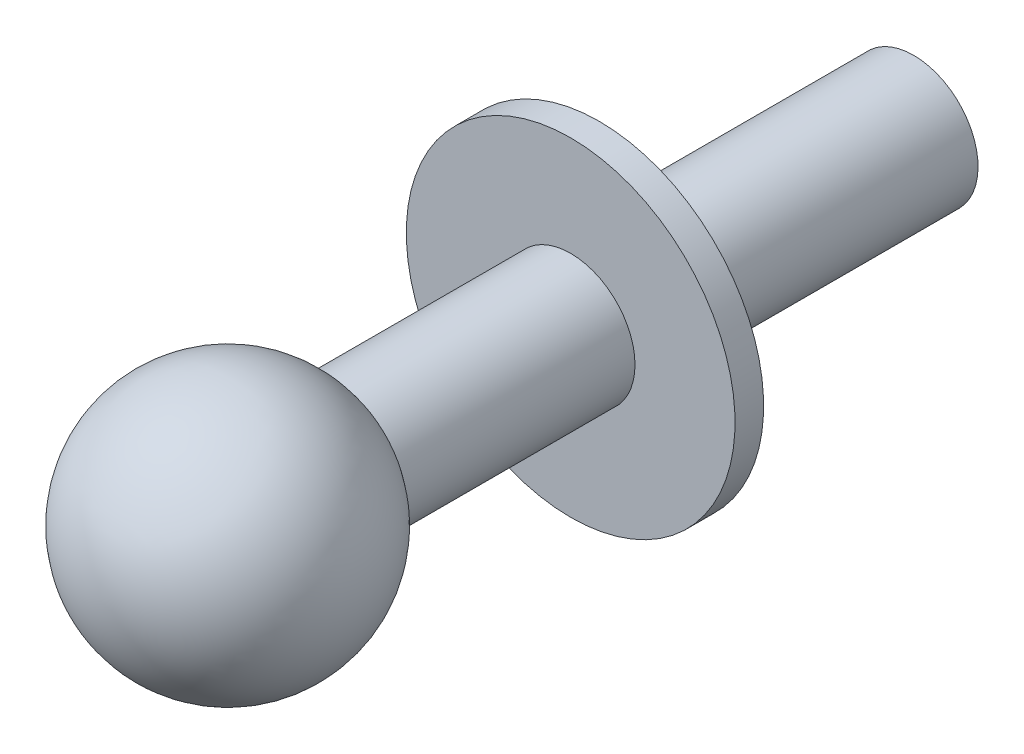
ISO-10303-21;
HEADER;
FILE_DESCRIPTION(('STEP AP214'),'2;1');
FILE_NAME('part.step','',(''),(''),'','','');
FILE_SCHEMA(('AUTOMOTIVE_DESIGN { 1 0 10303 214 1 1 1 1 }'));
ENDSEC;
DATA;
#1=APPLICATION_CONTEXT('core data for automotive mechanical design processes');
#2=APPLICATION_PROTOCOL_DEFINITION('international standard','automotive_design',2000,#1);
#3=PRODUCT_CONTEXT('',#1,'mechanical');
#4=PRODUCT('Part','Part','',(#3));
#5=PRODUCT_RELATED_PRODUCT_CATEGORY('part','',(#4));
#6=PRODUCT_DEFINITION_FORMATION('','',#4);
#7=PRODUCT_DEFINITION_CONTEXT('part definition',#1,'design');
#8=PRODUCT_DEFINITION('design','',#6,#7);
#9=PRODUCT_DEFINITION_SHAPE('','',#8);
#10=(LENGTH_UNIT() NAMED_UNIT(*) SI_UNIT(.MILLI.,.METRE.));
#11=(NAMED_UNIT(*) PLANE_ANGLE_UNIT() SI_UNIT($,.RADIAN.));
#12=(NAMED_UNIT(*) SI_UNIT($,.STERADIAN.) SOLID_ANGLE_UNIT());
#13=UNCERTAINTY_MEASURE_WITH_UNIT(LENGTH_MEASURE(1.E-05),#10,'distance_accuracy_value','');
#14=(GEOMETRIC_REPRESENTATION_CONTEXT(3) GLOBAL_UNCERTAINTY_ASSIGNED_CONTEXT((#13)) GLOBAL_UNIT_ASSIGNED_CONTEXT((#10,
#11,#12)) REPRESENTATION_CONTEXT('',''));
#15=CARTESIAN_POINT('',(0.,0.,0.));
#16=DIRECTION('',(0.,0.,1.));
#17=DIRECTION('',(1.,0.,0.));
#18=AXIS2_PLACEMENT_3D('',#15,#16,#17);
#19=CARTESIAN_POINT('',(563.303554735358,79.0193374646645,1357.2355645497));
#20=DIRECTION('',(0.,0.,1.));
#21=DIRECTION('',(0.,-1.,0.));
#22=AXIS2_PLACEMENT_3D('',#19,#20,#21);
#23=CYLINDRICAL_SURFACE('',#22,4.49999999999991);
#24=CARTESIAN_POINT('',(563.303554735358,79.0193374646647,1397.44133591564));
#25=DIRECTION('',(0.,0.,1.));
#26=DIRECTION('',(0.,-1.,0.));
#27=AXIS2_PLACEMENT_3D('',#24,#25,#26);
#28=CIRCLE('',#27,4.49999999999991);
#29=CARTESIAN_POINT('',(563.303554735358,74.5193374646648,1397.44133591564));
#30=VERTEX_POINT('',#29);
#31=EDGE_CURVE('E53',#30,#30,#28,.F.);
#32=ORIENTED_EDGE('',*,*,#31,.T.);
#33=EDGE_LOOP('',(#32));
#34=FACE_BOUND('',#33,.T.);
#35=CARTESIAN_POINT('',(563.303554735358,79.0193374646647,1381.2355645497));
#36=DIRECTION('',(0.,0.,-1.));
#37=DIRECTION('',(0.,1.,0.));
#38=AXIS2_PLACEMENT_3D('',#35,#36,#37);
#39=CIRCLE('',#38,4.49999999999991);
#40=CARTESIAN_POINT('',(563.303554735358,83.5193374646646,1381.2355645497));
#41=VERTEX_POINT('',#40);
#42=EDGE_CURVE('E10',#41,#41,#39,.T.);
#43=ORIENTED_EDGE('',*,*,#42,.F.);
#44=EDGE_LOOP('',(#43));
#45=FACE_BOUND('',#44,.T.);
#46=ADVANCED_FACE('F45',(#34,#45),#23,.T.);
#47=CARTESIAN_POINT('',(563.303554735358,79.0193374646647,1405.2355645497));
#48=DIRECTION('',(-1.,0.,0.));
#49=DIRECTION('',(0.,-1.,0.));
#50=AXIS2_PLACEMENT_3D('',#47,#48,#49);
#51=SPHERICAL_SURFACE('',#50,9.00000000000001);
#52=CARTESIAN_POINT('',(563.303554735358,79.0193374646647,1405.2355645497));
#53=DIRECTION('',(0.,0.,1.));
#54=DIRECTION('',(0.,-1.,0.));
#55=AXIS2_PLACEMENT_3D('',#52,#53,#54);
#56=SPHERICAL_SURFACE('',#55,9.00000000000001);
#57=ORIENTED_EDGE('',*,*,#31,.F.);
#58=EDGE_LOOP('',(#57));
#59=FACE_BOUND('',#58,.T.);
#60=ADVANCED_FACE('F47',(#59),#56,.T.);
#61=CARTESIAN_POINT('',(563.303554735358,79.0193374646647,1381.2355645497));
#62=DIRECTION('',(0.,0.,-1.));
#63=DIRECTION('',(0.,1.,0.));
#64=AXIS2_PLACEMENT_3D('',#61,#62,#63);
#65=CYLINDRICAL_SURFACE('',#64,11.4999999999999);
#66=CARTESIAN_POINT('',(563.303554735358,79.0193374646647,1381.2355645497));
#67=DIRECTION('',(0.,0.,-1.));
#68=DIRECTION('',(0.,1.,0.));
#69=AXIS2_PLACEMENT_3D('',#66,#67,#68);
#70=CIRCLE('',#69,11.4999999999999);
#71=CARTESIAN_POINT('',(563.303554735358,90.5193374646647,1381.2355645497));
#72=VERTEX_POINT('',#71);
#73=EDGE_CURVE('E70',#72,#72,#70,.T.);
#74=ORIENTED_EDGE('',*,*,#73,.T.);
#75=EDGE_LOOP('',(#74));
#76=FACE_BOUND('',#75,.T.);
#77=CARTESIAN_POINT('',(563.303554735358,79.0193374646647,1379.2355645497));
#78=DIRECTION('',(0.,0.,-1.));
#79=DIRECTION('',(0.,1.,0.));
#80=AXIS2_PLACEMENT_3D('',#77,#78,#79);
#81=CIRCLE('',#80,11.4999999999999);
#82=CARTESIAN_POINT('',(563.303554735358,90.5193374646647,1379.2355645497));
#83=VERTEX_POINT('',#82);
#84=EDGE_CURVE('E75',#83,#83,#81,.T.);
#85=ORIENTED_EDGE('',*,*,#84,.F.);
#86=EDGE_LOOP('',(#85));
#87=FACE_BOUND('',#86,.T.);
#88=ADVANCED_FACE('F84',(#76,#87),#65,.T.);
#89=CARTESIAN_POINT('',(563.303554735358,79.0193374646647,1381.2355645497));
#90=DIRECTION('',(0.,0.,-1.));
#91=DIRECTION('',(0.,1.,0.));
#92=AXIS2_PLACEMENT_3D('',#89,#90,#91);
#93=PLANE('',#92);
#94=ORIENTED_EDGE('',*,*,#42,.T.);
#95=EDGE_LOOP('',(#94));
#96=FACE_BOUND('',#95,.T.);
#97=ORIENTED_EDGE('',*,*,#73,.F.);
#98=EDGE_LOOP('',(#97));
#99=FACE_BOUND('',#98,.T.);
#100=ADVANCED_FACE('F86',(#96,#99),#93,.F.);
#101=CARTESIAN_POINT('',(563.303554735358,79.0193374646647,1379.2355645497));
#102=DIRECTION('',(0.,0.,-1.));
#103=DIRECTION('',(0.,1.,0.));
#104=AXIS2_PLACEMENT_3D('',#101,#102,#103);
#105=PLANE('',#104);
#106=CARTESIAN_POINT('',(563.303554735358,79.0193374646647,1379.2355645497));
#107=DIRECTION('',(0.,0.,-1.));
#108=DIRECTION('',(0.,1.,0.));
#109=AXIS2_PLACEMENT_3D('',#106,#107,#108);
#110=CIRCLE('',#109,4.49999999999991);
#111=CARTESIAN_POINT('',(563.303554735358,83.5193374646646,1379.2355645497));
#112=VERTEX_POINT('',#111);
#113=EDGE_CURVE('E65',#112,#112,#110,.T.);
#114=ORIENTED_EDGE('',*,*,#113,.F.);
#115=EDGE_LOOP('',(#114));
#116=FACE_BOUND('',#115,.T.);
#117=ORIENTED_EDGE('',*,*,#84,.T.);
#118=EDGE_LOOP('',(#117));
#119=FACE_BOUND('',#118,.T.);
#120=ADVANCED_FACE('F82',(#116,#119),#105,.T.);
#121=CARTESIAN_POINT('',(563.303554735358,79.0193374646645,1357.2355645497));
#122=DIRECTION('',(0.,0.,-1.));
#123=DIRECTION('',(0.,1.,0.));
#124=AXIS2_PLACEMENT_3D('',#121,#122,#123);
#125=PLANE('',#124);
#126=CARTESIAN_POINT('',(563.303554735358,79.0193374646645,1357.2355645497));
#127=DIRECTION('',(0.,0.,-1.));
#128=DIRECTION('',(0.,1.,0.));
#129=AXIS2_PLACEMENT_3D('',#126,#127,#128);
#130=CIRCLE('',#129,4.49999999999991);
#131=CARTESIAN_POINT('',(563.303554735358,83.5193374646644,1357.2355645497));
#132=VERTEX_POINT('',#131);
#133=EDGE_CURVE('E59',#132,#132,#130,.T.);
#134=ORIENTED_EDGE('',*,*,#133,.T.);
#135=EDGE_LOOP('',(#134));
#136=FACE_BOUND('',#135,.T.);
#137=ADVANCED_FACE('F104',(#136),#125,.T.);
#138=ORIENTED_EDGE('',*,*,#113,.T.);
#139=EDGE_LOOP('',(#138));
#140=FACE_BOUND('',#139,.T.);
#141=ORIENTED_EDGE('',*,*,#133,.F.);
#142=EDGE_LOOP('',(#141));
#143=FACE_BOUND('',#142,.T.);
#144=ADVANCED_FACE('F98',(#140,#143),#23,.T.);
#145=CLOSED_SHELL('',(#46,#60,#88,#100,#120,#137,#144));
#146=MANIFOLD_SOLID_BREP('B2',#145);
#147=ADVANCED_BREP_SHAPE_REPRESENTATION('',(#18,#146),#14);
#148=SHAPE_DEFINITION_REPRESENTATION(#9,#147);
ENDSEC;
END-ISO-10303-21;
